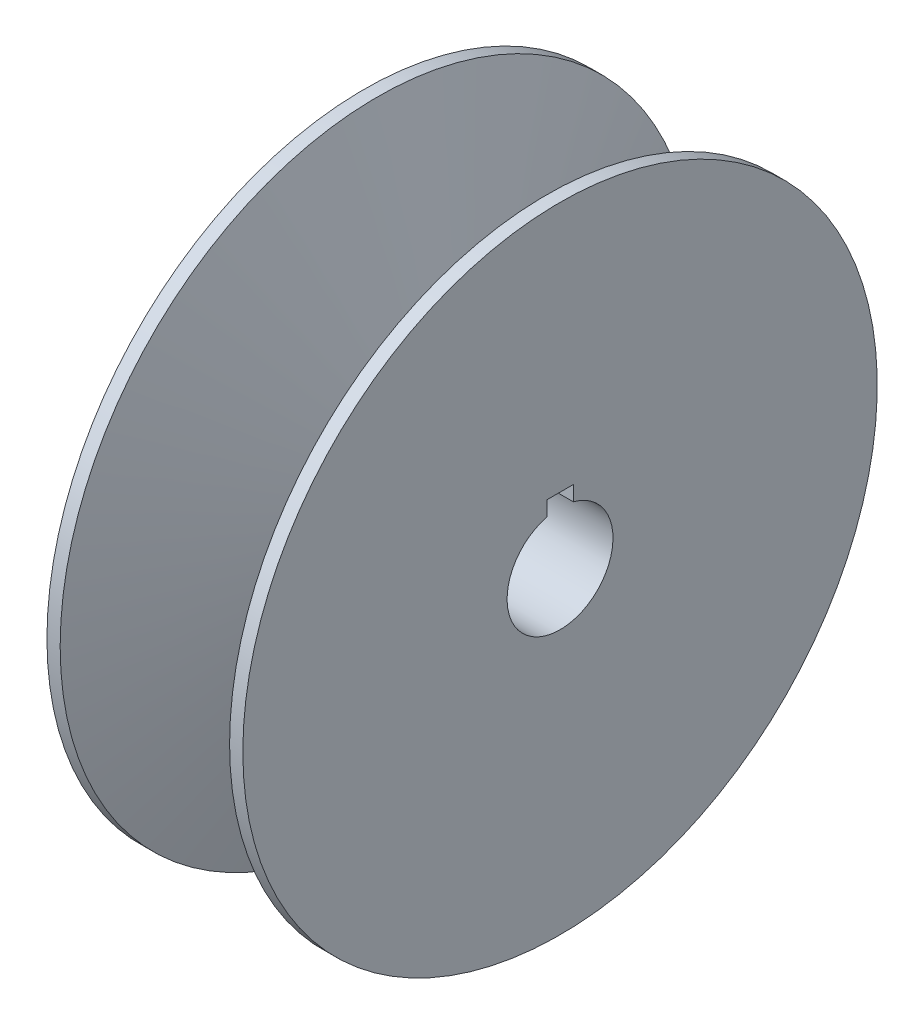
ISO-10303-21;
HEADER;
FILE_DESCRIPTION(('STEP AP214'),'2;1');
FILE_NAME('part.step','',(''),(''),'','','');
FILE_SCHEMA(('AUTOMOTIVE_DESIGN { 1 0 10303 214 1 1 1 1 }'));
ENDSEC;
DATA;
#1=APPLICATION_CONTEXT('core data for automotive mechanical design processes');
#2=APPLICATION_PROTOCOL_DEFINITION('international standard','automotive_design',2000,#1);
#3=PRODUCT_CONTEXT('',#1,'mechanical');
#4=PRODUCT('Part','Part','',(#3));
#5=PRODUCT_RELATED_PRODUCT_CATEGORY('part','',(#4));
#6=PRODUCT_DEFINITION_FORMATION('','',#4);
#7=PRODUCT_DEFINITION_CONTEXT('part definition',#1,'design');
#8=PRODUCT_DEFINITION('design','',#6,#7);
#9=PRODUCT_DEFINITION_SHAPE('','',#8);
#10=(LENGTH_UNIT() NAMED_UNIT(*) SI_UNIT(.MILLI.,.METRE.));
#11=(NAMED_UNIT(*) PLANE_ANGLE_UNIT() SI_UNIT($,.RADIAN.));
#12=(NAMED_UNIT(*) SI_UNIT($,.STERADIAN.) SOLID_ANGLE_UNIT());
#13=UNCERTAINTY_MEASURE_WITH_UNIT(LENGTH_MEASURE(1.E-05),#10,'distance_accuracy_value','');
#14=(GEOMETRIC_REPRESENTATION_CONTEXT(3) GLOBAL_UNCERTAINTY_ASSIGNED_CONTEXT((#13)) GLOBAL_UNIT_ASSIGNED_CONTEXT((#10,
#11,#12)) REPRESENTATION_CONTEXT('',''));
#15=CARTESIAN_POINT('',(0.,0.,0.));
#16=DIRECTION('',(0.,0.,1.));
#17=DIRECTION('',(1.,0.,0.));
#18=AXIS2_PLACEMENT_3D('',#15,#16,#17);
#19=CARTESIAN_POINT('',(43.815,0.,0.));
#20=DIRECTION('',(1.,0.,0.));
#21=DIRECTION('',(0.,0.,-1.));
#22=AXIS2_PLACEMENT_3D('',#19,#20,#21);
#23=PLANE('',#22);
#24=CARTESIAN_POINT('',(43.815,0.,0.));
#25=DIRECTION('',(-1.,0.,0.));
#26=DIRECTION('',(0.,0.,1.));
#27=AXIS2_PLACEMENT_3D('',#24,#25,#26);
#28=CIRCLE('',#27,76.09205);
#29=CARTESIAN_POINT('',(43.815,0.,76.09205));
#30=VERTEX_POINT('',#29);
#31=EDGE_CURVE('E92',#30,#30,#28,.T.);
#32=ORIENTED_EDGE('',*,*,#31,.F.);
#33=EDGE_LOOP('',(#32));
#34=FACE_BOUND('',#33,.T.);
#35=DIRECTION('',(0.,-1.,0.));
#36=VECTOR('',#35,1.);
#37=CARTESIAN_POINT('',(43.815,0.,-3.17500000000001));
#38=LINE('',#37,#36);
#39=CARTESIAN_POINT('',(43.815,15.875,-3.17500000000001));
#40=VERTEX_POINT('',#39);
#41=CARTESIAN_POINT('',(43.815,12.2967221242085,-3.17500000000001));
#42=VERTEX_POINT('',#41);
#43=EDGE_CURVE('E127',#40,#42,#38,.T.);
#44=ORIENTED_EDGE('',*,*,#43,.T.);
#45=CARTESIAN_POINT('',(43.815,0.,0.));
#46=DIRECTION('',(1.,0.,0.));
#47=DIRECTION('',(0.,0.,-1.));
#48=AXIS2_PLACEMENT_3D('',#45,#46,#47);
#49=CIRCLE('',#48,12.7);
#50=CARTESIAN_POINT('',(43.815,12.2967221242085,3.17500000000001));
#51=VERTEX_POINT('',#50);
#52=EDGE_CURVE('E124',#42,#51,#49,.F.);
#53=ORIENTED_EDGE('',*,*,#52,.T.);
#54=DIRECTION('',(0.,-1.,0.));
#55=VECTOR('',#54,1.);
#56=CARTESIAN_POINT('',(43.815,0.,3.17500000000001));
#57=LINE('',#56,#55);
#58=CARTESIAN_POINT('',(43.815,15.875,3.17500000000001));
#59=VERTEX_POINT('',#58);
#60=EDGE_CURVE('E131',#59,#51,#57,.T.);
#61=ORIENTED_EDGE('',*,*,#60,.F.);
#62=DIRECTION('',(0.,0.,-1.));
#63=VECTOR('',#62,1.);
#64=CARTESIAN_POINT('',(43.815,15.875,0.));
#65=LINE('',#64,#63);
#66=EDGE_CURVE('E99',#59,#40,#65,.T.);
#67=ORIENTED_EDGE('',*,*,#66,.T.);
#68=EDGE_LOOP('',(#44,#53,#61,#67));
#69=FACE_BOUND('',#68,.T.);
#70=ADVANCED_FACE('F50',(#34,#69),#23,.T.);
#71=CARTESIAN_POINT('',(-3.17500000000001,0.,0.));
#72=DIRECTION('',(1.,0.,0.));
#73=DIRECTION('',(0.,0.,-1.));
#74=AXIS2_PLACEMENT_3D('',#71,#72,#73);
#75=PLANE('',#74);
#76=CARTESIAN_POINT('',(-3.17500000000001,0.,0.));
#77=DIRECTION('',(-1.,0.,0.));
#78=DIRECTION('',(0.,0.,1.));
#79=AXIS2_PLACEMENT_3D('',#76,#77,#78);
#80=CIRCLE('',#79,76.09205);
#81=CARTESIAN_POINT('',(-3.17500000000001,0.,76.09205));
#82=VERTEX_POINT('',#81);
#83=EDGE_CURVE('E121',#82,#82,#80,.T.);
#84=ORIENTED_EDGE('',*,*,#83,.T.);
#85=EDGE_LOOP('',(#84));
#86=FACE_BOUND('',#85,.T.);
#87=CARTESIAN_POINT('',(-3.17499999999998,0.,0.));
#88=DIRECTION('',(1.,0.,0.));
#89=DIRECTION('',(0.,0.,-1.));
#90=AXIS2_PLACEMENT_3D('',#87,#88,#89);
#91=CIRCLE('',#90,12.7);
#92=CARTESIAN_POINT('',(-3.17499999999998,12.2967221242085,-3.17500000000001));
#93=VERTEX_POINT('',#92);
#94=CARTESIAN_POINT('',(-3.17500000000001,12.2967221242085,3.17500000000001));
#95=VERTEX_POINT('',#94);
#96=EDGE_CURVE('E13',#93,#95,#91,.F.);
#97=ORIENTED_EDGE('',*,*,#96,.F.);
#98=DIRECTION('',(0.,-1.,0.));
#99=VECTOR('',#98,1.);
#100=CARTESIAN_POINT('',(-3.17500000000001,0.,-3.17500000000001));
#101=LINE('',#100,#99);
#102=CARTESIAN_POINT('',(-3.17499999999998,15.875,-3.17500000000001));
#103=VERTEX_POINT('',#102);
#104=EDGE_CURVE('E57',#103,#93,#101,.T.);
#105=ORIENTED_EDGE('',*,*,#104,.F.);
#106=DIRECTION('',(0.,0.,-1.));
#107=VECTOR('',#106,1.);
#108=CARTESIAN_POINT('',(-3.17500000000001,15.875,0.));
#109=LINE('',#108,#107);
#110=CARTESIAN_POINT('',(-3.17499999999998,15.875,3.17500000000001));
#111=VERTEX_POINT('',#110);
#112=EDGE_CURVE('E91',#111,#103,#109,.T.);
#113=ORIENTED_EDGE('',*,*,#112,.F.);
#114=DIRECTION('',(0.,-1.,0.));
#115=VECTOR('',#114,1.);
#116=CARTESIAN_POINT('',(-3.17500000000001,0.,3.17500000000001));
#117=LINE('',#116,#115);
#118=EDGE_CURVE('E86',#111,#95,#117,.T.);
#119=ORIENTED_EDGE('',*,*,#118,.T.);
#120=EDGE_LOOP('',(#97,#105,#113,#119));
#121=FACE_BOUND('',#120,.T.);
#122=ADVANCED_FACE('F104',(#86,#121),#75,.F.);
#123=CARTESIAN_POINT('',(0.,0.,0.));
#124=DIRECTION('',(-1.,0.,0.));
#125=DIRECTION('',(0.,0.,1.));
#126=AXIS2_PLACEMENT_3D('',#123,#124,#125);
#127=CYLINDRICAL_SURFACE('',#126,76.09205);
#128=ORIENTED_EDGE('',*,*,#31,.T.);
#129=EDGE_LOOP('',(#128));
#130=FACE_BOUND('',#129,.T.);
#131=CARTESIAN_POINT('',(40.64,0.,0.));
#132=DIRECTION('',(-1.,0.,0.));
#133=DIRECTION('',(0.,0.,1.));
#134=AXIS2_PLACEMENT_3D('',#131,#132,#133);
#135=CIRCLE('',#134,76.09205);
#136=CARTESIAN_POINT('',(40.64,0.,76.09205));
#137=VERTEX_POINT('',#136);
#138=EDGE_CURVE('E109',#137,#137,#135,.T.);
#139=ORIENTED_EDGE('',*,*,#138,.F.);
#140=EDGE_LOOP('',(#139));
#141=FACE_BOUND('',#140,.T.);
#142=ADVANCED_FACE('F160',(#130,#141),#127,.T.);
#143=CARTESIAN_POINT('',(40.64,0.,0.));
#144=DIRECTION('',(1.,0.,0.));
#145=DIRECTION('',(0.,0.,-1.));
#146=AXIS2_PLACEMENT_3D('',#143,#144,#145);
#147=CONICAL_SURFACE('',#146,76.09205,1.28500702817278);
#148=CARTESIAN_POINT('',(27.4015465377544,0.,0.));
#149=DIRECTION('',(-1.,0.,0.));
#150=DIRECTION('',(0.,0.,1.));
#151=AXIS2_PLACEMENT_3D('',#148,#149,#150);
#152=CIRCLE('',#151,31.0376815067281);
#153=CARTESIAN_POINT('',(27.4015465377544,0.,31.0376815067281));
#154=VERTEX_POINT('',#153);
#155=EDGE_CURVE('E112',#154,#154,#152,.T.);
#156=ORIENTED_EDGE('',*,*,#155,.F.);
#157=EDGE_LOOP('',(#156));
#158=FACE_BOUND('',#157,.T.);
#159=ORIENTED_EDGE('',*,*,#138,.T.);
#160=EDGE_LOOP('',(#159));
#161=FACE_BOUND('',#160,.T.);
#162=ADVANCED_FACE('F166',(#158,#161),#147,.T.);
#163=CARTESIAN_POINT('',(0.,0.,0.));
#164=DIRECTION('',(-1.,0.,0.));
#165=DIRECTION('',(0.,0.,1.));
#166=AXIS2_PLACEMENT_3D('',#163,#164,#165);
#167=CYLINDRICAL_SURFACE('',#166,31.0376815067281);
#168=ORIENTED_EDGE('',*,*,#155,.T.);
#169=EDGE_LOOP('',(#168));
#170=FACE_BOUND('',#169,.T.);
#171=CARTESIAN_POINT('',(13.2384534622456,0.,0.));
#172=DIRECTION('',(-1.,0.,0.));
#173=DIRECTION('',(0.,0.,1.));
#174=AXIS2_PLACEMENT_3D('',#171,#172,#173);
#175=CIRCLE('',#174,31.0376815067281);
#176=CARTESIAN_POINT('',(13.2384534622456,0.,31.0376815067281));
#177=VERTEX_POINT('',#176);
#178=EDGE_CURVE('E115',#177,#177,#175,.T.);
#179=ORIENTED_EDGE('',*,*,#178,.F.);
#180=EDGE_LOOP('',(#179));
#181=FACE_BOUND('',#180,.T.);
#182=ADVANCED_FACE('F170',(#170,#181),#167,.T.);
#183=CARTESIAN_POINT('',(0.,0.,0.));
#184=DIRECTION('',(-1.,0.,0.));
#185=DIRECTION('',(0.,0.,1.));
#186=AXIS2_PLACEMENT_3D('',#183,#184,#185);
#187=CONICAL_SURFACE('',#186,76.09205,1.28500702817278);
#188=ORIENTED_EDGE('',*,*,#178,.T.);
#189=EDGE_LOOP('',(#188));
#190=FACE_BOUND('',#189,.T.);
#191=CARTESIAN_POINT('',(0.,0.,0.));
#192=DIRECTION('',(-1.,0.,0.));
#193=DIRECTION('',(0.,0.,1.));
#194=AXIS2_PLACEMENT_3D('',#191,#192,#193);
#195=CIRCLE('',#194,76.09205);
#196=CARTESIAN_POINT('',(0.,0.,76.09205));
#197=VERTEX_POINT('',#196);
#198=EDGE_CURVE('E118',#197,#197,#195,.T.);
#199=ORIENTED_EDGE('',*,*,#198,.F.);
#200=EDGE_LOOP('',(#199));
#201=FACE_BOUND('',#200,.T.);
#202=ADVANCED_FACE('F151',(#190,#201),#187,.T.);
#203=CARTESIAN_POINT('',(0.,0.,0.));
#204=DIRECTION('',(-1.,0.,0.));
#205=DIRECTION('',(0.,0.,1.));
#206=AXIS2_PLACEMENT_3D('',#203,#204,#205);
#207=CYLINDRICAL_SURFACE('',#206,76.09205);
#208=ORIENTED_EDGE('',*,*,#83,.F.);
#209=EDGE_LOOP('',(#208));
#210=FACE_BOUND('',#209,.T.);
#211=ORIENTED_EDGE('',*,*,#198,.T.);
#212=EDGE_LOOP('',(#211));
#213=FACE_BOUND('',#212,.T.);
#214=ADVANCED_FACE('F144',(#210,#213),#207,.T.);
#215=CARTESIAN_POINT('',(68.961,0.,0.));
#216=DIRECTION('',(-1.,0.,0.));
#217=DIRECTION('',(0.,0.,1.));
#218=AXIS2_PLACEMENT_3D('',#215,#216,#217);
#219=CYLINDRICAL_SURFACE('',#218,12.7);
#220=DIRECTION('',(-1.,0.,0.));
#221=VECTOR('',#220,1.);
#222=CARTESIAN_POINT('',(68.961,12.2967221242085,-3.17500000000001));
#223=LINE('',#222,#221);
#224=EDGE_CURVE('E133',#42,#93,#223,.T.);
#225=ORIENTED_EDGE('',*,*,#224,.T.);
#226=ORIENTED_EDGE('',*,*,#96,.T.);
#227=DIRECTION('',(-1.,0.,0.));
#228=VECTOR('',#227,1.);
#229=CARTESIAN_POINT('',(68.961,12.2967221242085,3.17500000000001));
#230=LINE('',#229,#228);
#231=EDGE_CURVE('E69',#51,#95,#230,.T.);
#232=ORIENTED_EDGE('',*,*,#231,.F.);
#233=ORIENTED_EDGE('',*,*,#52,.F.);
#234=EDGE_LOOP('',(#225,#226,#232,#233));
#235=FACE_BOUND('',#234,.T.);
#236=ADVANCED_FACE('F142',(#235),#219,.F.);
#237=CARTESIAN_POINT('',(68.961,0.,-3.17500000000001));
#238=DIRECTION('',(0.,0.,1.));
#239=DIRECTION('',(1.,0.,0.));
#240=AXIS2_PLACEMENT_3D('',#237,#238,#239);
#241=PLANE('',#240);
#242=DIRECTION('',(-1.,0.,0.));
#243=VECTOR('',#242,1.);
#244=CARTESIAN_POINT('',(68.961,15.875,-3.17500000000001));
#245=LINE('',#244,#243);
#246=EDGE_CURVE('E101',#40,#103,#245,.T.);
#247=ORIENTED_EDGE('',*,*,#246,.T.);
#248=ORIENTED_EDGE('',*,*,#104,.T.);
#249=ORIENTED_EDGE('',*,*,#224,.F.);
#250=ORIENTED_EDGE('',*,*,#43,.F.);
#251=EDGE_LOOP('',(#247,#248,#249,#250));
#252=FACE_BOUND('',#251,.T.);
#253=ADVANCED_FACE('F138',(#252),#241,.T.);
#254=CARTESIAN_POINT('',(68.961,15.875,0.));
#255=DIRECTION('',(0.,-1.,0.));
#256=DIRECTION('',(0.,0.,-1.));
#257=AXIS2_PLACEMENT_3D('',#254,#255,#256);
#258=PLANE('',#257);
#259=DIRECTION('',(-1.,0.,0.));
#260=VECTOR('',#259,1.);
#261=CARTESIAN_POINT('',(68.961,15.875,3.17500000000001));
#262=LINE('',#261,#260);
#263=EDGE_CURVE('E64',#59,#111,#262,.T.);
#264=ORIENTED_EDGE('',*,*,#263,.T.);
#265=ORIENTED_EDGE('',*,*,#112,.T.);
#266=ORIENTED_EDGE('',*,*,#246,.F.);
#267=ORIENTED_EDGE('',*,*,#66,.F.);
#268=EDGE_LOOP('',(#264,#265,#266,#267));
#269=FACE_BOUND('',#268,.T.);
#270=ADVANCED_FACE('F95',(#269),#258,.T.);
#271=CARTESIAN_POINT('',(68.961,0.,3.17500000000001));
#272=DIRECTION('',(0.,0.,1.));
#273=DIRECTION('',(1.,0.,0.));
#274=AXIS2_PLACEMENT_3D('',#271,#272,#273);
#275=PLANE('',#274);
#276=ORIENTED_EDGE('',*,*,#60,.T.);
#277=ORIENTED_EDGE('',*,*,#231,.T.);
#278=ORIENTED_EDGE('',*,*,#118,.F.);
#279=ORIENTED_EDGE('',*,*,#263,.F.);
#280=EDGE_LOOP('',(#276,#277,#278,#279));
#281=FACE_BOUND('',#280,.T.);
#282=ADVANCED_FACE('F87',(#281),#275,.F.);
#283=CLOSED_SHELL('',(#70,#122,#142,#162,#182,#202,#214,#236,#253,#270,#282));
#284=MANIFOLD_SOLID_BREP('B2',#283);
#285=ADVANCED_BREP_SHAPE_REPRESENTATION('',(#18,#284),#14);
#286=SHAPE_DEFINITION_REPRESENTATION(#9,#285);
ENDSEC;
END-ISO-10303-21;
